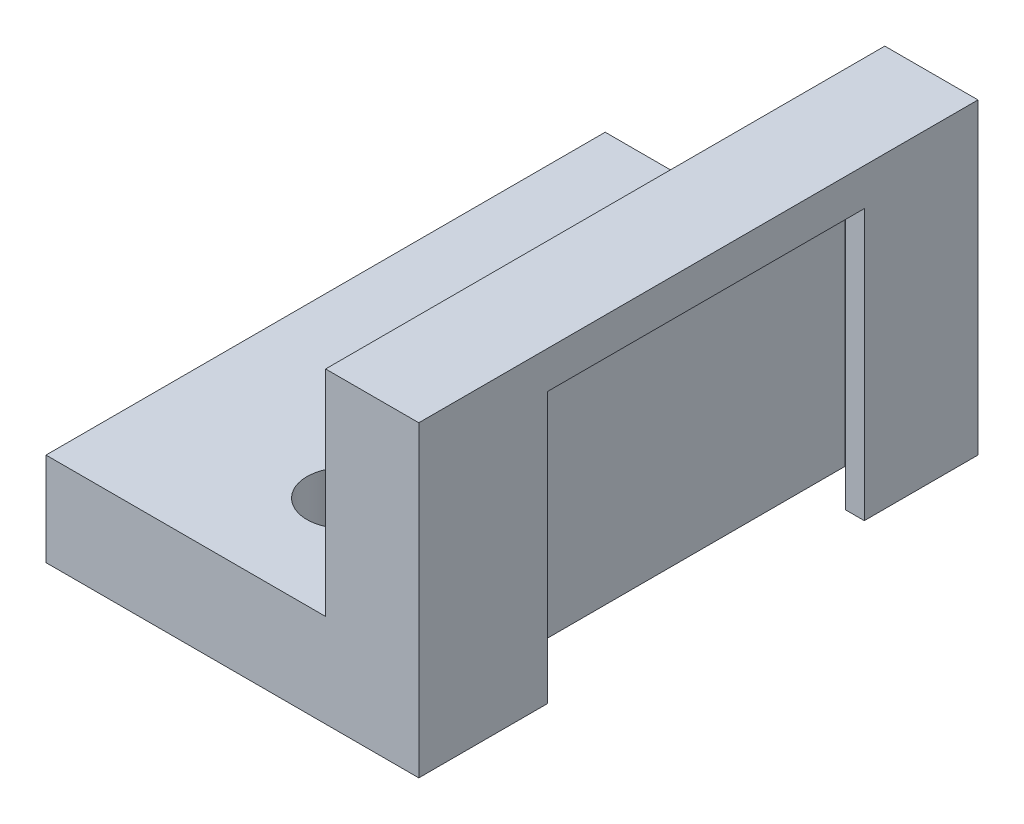
ISO-10303-21;
HEADER;
FILE_DESCRIPTION(('STEP AP214'),'2;1');
FILE_NAME('part.step','',(''),(''),'','','');
FILE_SCHEMA(('AUTOMOTIVE_DESIGN { 1 0 10303 214 1 1 1 1 }'));
ENDSEC;
DATA;
#1=APPLICATION_CONTEXT('core data for automotive mechanical design processes');
#2=APPLICATION_PROTOCOL_DEFINITION('international standard','automotive_design',2000,#1);
#3=PRODUCT_CONTEXT('',#1,'mechanical');
#4=PRODUCT('Part','Part','',(#3));
#5=PRODUCT_RELATED_PRODUCT_CATEGORY('part','',(#4));
#6=PRODUCT_DEFINITION_FORMATION('','',#4);
#7=PRODUCT_DEFINITION_CONTEXT('part definition',#1,'design');
#8=PRODUCT_DEFINITION('design','',#6,#7);
#9=PRODUCT_DEFINITION_SHAPE('','',#8);
#10=(LENGTH_UNIT() NAMED_UNIT(*) SI_UNIT(.MILLI.,.METRE.));
#11=(NAMED_UNIT(*) PLANE_ANGLE_UNIT() SI_UNIT($,.RADIAN.));
#12=(NAMED_UNIT(*) SI_UNIT($,.STERADIAN.) SOLID_ANGLE_UNIT());
#13=UNCERTAINTY_MEASURE_WITH_UNIT(LENGTH_MEASURE(1.E-05),#10,'distance_accuracy_value','');
#14=(GEOMETRIC_REPRESENTATION_CONTEXT(3) GLOBAL_UNCERTAINTY_ASSIGNED_CONTEXT((#13)) GLOBAL_UNIT_ASSIGNED_CONTEXT((#10,
#11,#12)) REPRESENTATION_CONTEXT('',''));
#15=CARTESIAN_POINT('',(0.,0.,0.));
#16=DIRECTION('',(0.,0.,1.));
#17=DIRECTION('',(1.,0.,0.));
#18=AXIS2_PLACEMENT_3D('',#15,#16,#17);
#19=CARTESIAN_POINT('',(10.,-0.00100000000000013,24.));
#20=DIRECTION('',(0.,1.,0.));
#21=DIRECTION('',(0.,0.,1.));
#22=AXIS2_PLACEMENT_3D('',#19,#20,#21);
#23=CYLINDRICAL_SURFACE('',#22,2.);
#24=CARTESIAN_POINT('',(10.,5.,24.));
#25=DIRECTION('',(0.,1.,0.));
#26=DIRECTION('',(0.,0.,-1.));
#27=AXIS2_PLACEMENT_3D('',#24,#25,#26);
#28=CIRCLE('',#27,2.);
#29=CARTESIAN_POINT('',(10.,5.,22.));
#30=VERTEX_POINT('',#29);
#31=EDGE_CURVE('E203',#30,#30,#28,.T.);
#32=ORIENTED_EDGE('',*,*,#31,.T.);
#33=EDGE_LOOP('',(#32));
#34=FACE_BOUND('',#33,.T.);
#35=CARTESIAN_POINT('',(10.,2.,24.));
#36=DIRECTION('',(0.,-1.,0.));
#37=DIRECTION('',(0.,0.,-1.));
#38=AXIS2_PLACEMENT_3D('',#35,#36,#37);
#39=CIRCLE('',#38,2.);
#40=CARTESIAN_POINT('',(10.,2.,22.));
#41=VERTEX_POINT('',#40);
#42=EDGE_CURVE('E191',#41,#41,#39,.F.);
#43=ORIENTED_EDGE('',*,*,#42,.F.);
#44=EDGE_LOOP('',(#43));
#45=FACE_BOUND('',#44,.T.);
#46=ADVANCED_FACE('F39',(#34,#45),#23,.F.);
#47=CARTESIAN_POINT('',(0.,0.,30.));
#48=DIRECTION('',(0.,1.,0.));
#49=DIRECTION('',(0.,0.,1.));
#50=AXIS2_PLACEMENT_3D('',#47,#48,#49);
#51=PLANE('',#50);
#52=CARTESIAN_POINT('',(10.,0.,24.));
#53=DIRECTION('',(0.,-1.,0.));
#54=DIRECTION('',(0.,0.,-1.));
#55=AXIS2_PLACEMENT_3D('',#52,#53,#54);
#56=CIRCLE('',#55,3.25);
#57=CARTESIAN_POINT('',(10.,0.,20.75));
#58=VERTEX_POINT('',#57);
#59=EDGE_CURVE('E192',#58,#58,#56,.T.);
#60=ORIENTED_EDGE('',*,*,#59,.F.);
#61=EDGE_LOOP('',(#60));
#62=FACE_BOUND('',#61,.T.);
#63=CARTESIAN_POINT('',(10.,0.,6.));
#64=DIRECTION('',(0.,-1.,0.));
#65=DIRECTION('',(0.,0.,1.));
#66=AXIS2_PLACEMENT_3D('',#63,#64,#65);
#67=CIRCLE('',#66,3.25);
#68=CARTESIAN_POINT('',(10.,0.,9.25));
#69=VERTEX_POINT('',#68);
#70=EDGE_CURVE('E185',#69,#69,#67,.T.);
#71=ORIENTED_EDGE('',*,*,#70,.F.);
#72=EDGE_LOOP('',(#71));
#73=FACE_BOUND('',#72,.T.);
#74=DIRECTION('',(0.,0.,-1.));
#75=VECTOR('',#74,1.);
#76=CARTESIAN_POINT('',(20.,0.,30.));
#77=LINE('',#76,#75);
#78=CARTESIAN_POINT('',(20.,0.,6.1));
#79=VERTEX_POINT('',#78);
#80=CARTESIAN_POINT('',(20.,0.,0.));
#81=VERTEX_POINT('',#80);
#82=EDGE_CURVE('E50',#79,#81,#77,.T.);
#83=ORIENTED_EDGE('',*,*,#82,.F.);
#84=DIRECTION('',(1.,0.,0.));
#85=VECTOR('',#84,1.);
#86=CARTESIAN_POINT('',(0.,0.,6.1));
#87=LINE('',#86,#85);
#88=CARTESIAN_POINT('',(19.,0.,6.1));
#89=VERTEX_POINT('',#88);
#90=EDGE_CURVE('E231',#89,#79,#87,.T.);
#91=ORIENTED_EDGE('',*,*,#90,.F.);
#92=DIRECTION('',(0.,0.,1.));
#93=VECTOR('',#92,1.);
#94=CARTESIAN_POINT('',(19.,0.,0.));
#95=LINE('',#94,#93);
#96=CARTESIAN_POINT('',(19.,0.,4.1));
#97=VERTEX_POINT('',#96);
#98=EDGE_CURVE('E263',#97,#89,#95,.T.);
#99=ORIENTED_EDGE('',*,*,#98,.F.);
#100=DIRECTION('',(1.,0.,0.));
#101=VECTOR('',#100,1.);
#102=CARTESIAN_POINT('',(0.,0.,4.1));
#103=LINE('',#102,#101);
#104=CARTESIAN_POINT('',(16.96,0.,4.1));
#105=VERTEX_POINT('',#104);
#106=EDGE_CURVE('E207',#105,#97,#103,.T.);
#107=ORIENTED_EDGE('',*,*,#106,.F.);
#108=DIRECTION('',(0.,0.,1.));
#109=VECTOR('',#108,1.);
#110=CARTESIAN_POINT('',(16.96,0.,0.));
#111=LINE('',#110,#109);
#112=CARTESIAN_POINT('',(16.96,0.,25.1));
#113=VERTEX_POINT('',#112);
#114=EDGE_CURVE('E215',#105,#113,#111,.T.);
#115=ORIENTED_EDGE('',*,*,#114,.T.);
#116=DIRECTION('',(1.,0.,0.));
#117=VECTOR('',#116,1.);
#118=CARTESIAN_POINT('',(0.,0.,25.1));
#119=LINE('',#118,#117);
#120=CARTESIAN_POINT('',(19.,0.,25.1));
#121=VERTEX_POINT('',#120);
#122=EDGE_CURVE('E219',#113,#121,#119,.T.);
#123=ORIENTED_EDGE('',*,*,#122,.T.);
#124=DIRECTION('',(0.,0.,-1.));
#125=VECTOR('',#124,1.);
#126=CARTESIAN_POINT('',(19.,0.,0.));
#127=LINE('',#126,#125);
#128=CARTESIAN_POINT('',(19.,0.,23.1));
#129=VERTEX_POINT('',#128);
#130=EDGE_CURVE('E223',#121,#129,#127,.T.);
#131=ORIENTED_EDGE('',*,*,#130,.T.);
#132=DIRECTION('',(1.,0.,0.));
#133=VECTOR('',#132,1.);
#134=CARTESIAN_POINT('',(0.,0.,23.1000000000001));
#135=LINE('',#134,#133);
#136=CARTESIAN_POINT('',(20.,0.,23.1));
#137=VERTEX_POINT('',#136);
#138=EDGE_CURVE('E227',#129,#137,#135,.T.);
#139=ORIENTED_EDGE('',*,*,#138,.T.);
#140=CARTESIAN_POINT('',(20.,0.,30.));
#141=VERTEX_POINT('',#140);
#142=EDGE_CURVE('E11',#141,#137,#77,.T.);
#143=ORIENTED_EDGE('',*,*,#142,.F.);
#144=DIRECTION('',(1.,0.,0.));
#145=VECTOR('',#144,1.);
#146=CARTESIAN_POINT('',(0.,0.,30.));
#147=LINE('',#146,#145);
#148=CARTESIAN_POINT('',(0.,0.,30.));
#149=VERTEX_POINT('',#148);
#150=EDGE_CURVE('E295',#149,#141,#147,.T.);
#151=ORIENTED_EDGE('',*,*,#150,.F.);
#152=DIRECTION('',(0.,0.,-1.));
#153=VECTOR('',#152,1.);
#154=CARTESIAN_POINT('',(0.,0.,30.));
#155=LINE('',#154,#153);
#156=CARTESIAN_POINT('',(0.,0.,0.));
#157=VERTEX_POINT('',#156);
#158=EDGE_CURVE('E304',#149,#157,#155,.T.);
#159=ORIENTED_EDGE('',*,*,#158,.T.);
#160=DIRECTION('',(1.,0.,0.));
#161=VECTOR('',#160,1.);
#162=CARTESIAN_POINT('',(0.,0.,0.));
#163=LINE('',#162,#161);
#164=EDGE_CURVE('E294',#157,#81,#163,.T.);
#165=ORIENTED_EDGE('',*,*,#164,.T.);
#166=EDGE_LOOP('',(#83,#91,#99,#107,#115,#123,#131,#139,#143,#151,#159,#165));
#167=FACE_BOUND('',#166,.T.);
#168=ADVANCED_FACE('F41',(#62,#73,#167),#51,.F.);
#169=CARTESIAN_POINT('',(20.,0.,30.));
#170=DIRECTION('',(-1.,0.,0.));
#171=DIRECTION('',(0.,-1.,0.));
#172=AXIS2_PLACEMENT_3D('',#169,#170,#171);
#173=PLANE('',#172);
#174=DIRECTION('',(0.,1.,0.));
#175=VECTOR('',#174,1.);
#176=CARTESIAN_POINT('',(20.,0.,0.));
#177=LINE('',#176,#175);
#178=CARTESIAN_POINT('',(20.,16.5,0.));
#179=VERTEX_POINT('',#178);
#180=EDGE_CURVE('E308',#81,#179,#177,.T.);
#181=ORIENTED_EDGE('',*,*,#180,.T.);
#182=DIRECTION('',(0.,0.,-1.));
#183=VECTOR('',#182,1.);
#184=CARTESIAN_POINT('',(20.,16.5,0.));
#185=LINE('',#184,#183);
#186=CARTESIAN_POINT('',(20.,16.5,30.));
#187=VERTEX_POINT('',#186);
#188=EDGE_CURVE('E169',#187,#179,#185,.T.);
#189=ORIENTED_EDGE('',*,*,#188,.F.);
#190=DIRECTION('',(0.,1.,0.));
#191=VECTOR('',#190,1.);
#192=CARTESIAN_POINT('',(20.,0.,30.));
#193=LINE('',#192,#191);
#194=EDGE_CURVE('E90',#141,#187,#193,.T.);
#195=ORIENTED_EDGE('',*,*,#194,.F.);
#196=ORIENTED_EDGE('',*,*,#142,.T.);
#197=DIRECTION('',(0.,1.,0.));
#198=VECTOR('',#197,1.);
#199=CARTESIAN_POINT('',(20.,-0.000999999999999265,23.1));
#200=LINE('',#199,#198);
#201=CARTESIAN_POINT('',(20.,14.5,23.1));
#202=VERTEX_POINT('',#201);
#203=EDGE_CURVE('E264',#137,#202,#200,.T.);
#204=ORIENTED_EDGE('',*,*,#203,.T.);
#205=DIRECTION('',(0.,0.,-1.));
#206=VECTOR('',#205,1.);
#207=CARTESIAN_POINT('',(20.,14.5,0.));
#208=LINE('',#207,#206);
#209=CARTESIAN_POINT('',(20.,14.5,6.09999999999999));
#210=VERTEX_POINT('',#209);
#211=EDGE_CURVE('E176',#202,#210,#208,.T.);
#212=ORIENTED_EDGE('',*,*,#211,.T.);
#213=DIRECTION('',(0.,1.,0.));
#214=VECTOR('',#213,1.);
#215=CARTESIAN_POINT('',(20.,-0.000999999999999265,6.1));
#216=LINE('',#215,#214);
#217=EDGE_CURVE('E259',#79,#210,#216,.T.);
#218=ORIENTED_EDGE('',*,*,#217,.F.);
#219=ORIENTED_EDGE('',*,*,#82,.T.);
#220=EDGE_LOOP('',(#181,#189,#195,#196,#204,#212,#218,#219));
#221=FACE_BOUND('',#220,.T.);
#222=ADVANCED_FACE('F356',(#221),#173,.F.);
#223=CARTESIAN_POINT('',(15.,14.5,30.));
#224=DIRECTION('',(1.,0.,0.));
#225=DIRECTION('',(0.,1.,0.));
#226=AXIS2_PLACEMENT_3D('',#223,#224,#225);
#227=PLANE('',#226);
#228=DIRECTION('',(0.,-1.,0.));
#229=VECTOR('',#228,1.);
#230=CARTESIAN_POINT('',(15.,14.5,0.));
#231=LINE('',#230,#229);
#232=CARTESIAN_POINT('',(15.,16.5,0.));
#233=VERTEX_POINT('',#232);
#234=CARTESIAN_POINT('',(15.,5.,0.));
#235=VERTEX_POINT('',#234);
#236=EDGE_CURVE('E311',#233,#235,#231,.T.);
#237=ORIENTED_EDGE('',*,*,#236,.T.);
#238=DIRECTION('',(0.,0.,-1.));
#239=VECTOR('',#238,1.);
#240=CARTESIAN_POINT('',(15.,5.,30.));
#241=LINE('',#240,#239);
#242=CARTESIAN_POINT('',(15.,5.,30.));
#243=VERTEX_POINT('',#242);
#244=EDGE_CURVE('E158',#243,#235,#241,.T.);
#245=ORIENTED_EDGE('',*,*,#244,.F.);
#246=DIRECTION('',(0.,-1.,0.));
#247=VECTOR('',#246,1.);
#248=CARTESIAN_POINT('',(15.,14.5,30.));
#249=LINE('',#248,#247);
#250=CARTESIAN_POINT('',(15.,16.5,30.));
#251=VERTEX_POINT('',#250);
#252=EDGE_CURVE('E153',#251,#243,#249,.T.);
#253=ORIENTED_EDGE('',*,*,#252,.F.);
#254=DIRECTION('',(0.,0.,1.));
#255=VECTOR('',#254,1.);
#256=CARTESIAN_POINT('',(15.,16.5,0.));
#257=LINE('',#256,#255);
#258=EDGE_CURVE('E157',#233,#251,#257,.T.);
#259=ORIENTED_EDGE('',*,*,#258,.F.);
#260=EDGE_LOOP('',(#237,#245,#253,#259));
#261=FACE_BOUND('',#260,.T.);
#262=ADVANCED_FACE('F155',(#261),#227,.F.);
#263=CARTESIAN_POINT('',(15.,5.,30.));
#264=DIRECTION('',(0.,-1.,0.));
#265=DIRECTION('',(0.,0.,-1.));
#266=AXIS2_PLACEMENT_3D('',#263,#264,#265);
#267=PLANE('',#266);
#268=ORIENTED_EDGE('',*,*,#31,.F.);
#269=EDGE_LOOP('',(#268));
#270=FACE_BOUND('',#269,.T.);
#271=CARTESIAN_POINT('',(10.,5.,6.));
#272=DIRECTION('',(0.,1.,0.));
#273=DIRECTION('',(0.,0.,1.));
#274=AXIS2_PLACEMENT_3D('',#271,#272,#273);
#275=CIRCLE('',#274,2.);
#276=CARTESIAN_POINT('',(10.,5.,8.));
#277=VERTEX_POINT('',#276);
#278=EDGE_CURVE('E208',#277,#277,#275,.T.);
#279=ORIENTED_EDGE('',*,*,#278,.F.);
#280=EDGE_LOOP('',(#279));
#281=FACE_BOUND('',#280,.T.);
#282=DIRECTION('',(-1.,0.,0.));
#283=VECTOR('',#282,1.);
#284=CARTESIAN_POINT('',(15.,5.,0.));
#285=LINE('',#284,#283);
#286=CARTESIAN_POINT('',(0.,5.,0.));
#287=VERTEX_POINT('',#286);
#288=EDGE_CURVE('E77',#235,#287,#285,.T.);
#289=ORIENTED_EDGE('',*,*,#288,.T.);
#290=DIRECTION('',(0.,0.,-1.));
#291=VECTOR('',#290,1.);
#292=CARTESIAN_POINT('',(0.,5.,30.));
#293=LINE('',#292,#291);
#294=CARTESIAN_POINT('',(0.,5.,30.));
#295=VERTEX_POINT('',#294);
#296=EDGE_CURVE('E320',#295,#287,#293,.T.);
#297=ORIENTED_EDGE('',*,*,#296,.F.);
#298=DIRECTION('',(-1.,0.,0.));
#299=VECTOR('',#298,1.);
#300=CARTESIAN_POINT('',(15.,5.,30.));
#301=LINE('',#300,#299);
#302=EDGE_CURVE('E161',#243,#295,#301,.T.);
#303=ORIENTED_EDGE('',*,*,#302,.F.);
#304=ORIENTED_EDGE('',*,*,#244,.T.);
#305=EDGE_LOOP('',(#289,#297,#303,#304));
#306=FACE_BOUND('',#305,.T.);
#307=ADVANCED_FACE('F399',(#270,#281,#306),#267,.F.);
#308=CARTESIAN_POINT('',(0.,5.,30.));
#309=DIRECTION('',(1.,0.,0.));
#310=DIRECTION('',(0.,1.,0.));
#311=AXIS2_PLACEMENT_3D('',#308,#309,#310);
#312=PLANE('',#311);
#313=DIRECTION('',(0.,-1.,0.));
#314=VECTOR('',#313,1.);
#315=CARTESIAN_POINT('',(0.,5.,0.));
#316=LINE('',#315,#314);
#317=EDGE_CURVE('E83',#287,#157,#316,.T.);
#318=ORIENTED_EDGE('',*,*,#317,.T.);
#319=ORIENTED_EDGE('',*,*,#158,.F.);
#320=DIRECTION('',(0.,-1.,0.));
#321=VECTOR('',#320,1.);
#322=CARTESIAN_POINT('',(0.,5.,30.));
#323=LINE('',#322,#321);
#324=EDGE_CURVE('E59',#295,#149,#323,.T.);
#325=ORIENTED_EDGE('',*,*,#324,.F.);
#326=ORIENTED_EDGE('',*,*,#296,.T.);
#327=EDGE_LOOP('',(#318,#319,#325,#326));
#328=FACE_BOUND('',#327,.T.);
#329=ADVANCED_FACE('F393',(#328),#312,.F.);
#330=CARTESIAN_POINT('',(0.,0.,30.));
#331=DIRECTION('',(0.,0.,1.));
#332=DIRECTION('',(1.,0.,0.));
#333=AXIS2_PLACEMENT_3D('',#330,#331,#332);
#334=PLANE('',#333);
#335=ORIENTED_EDGE('',*,*,#150,.T.);
#336=ORIENTED_EDGE('',*,*,#194,.T.);
#337=DIRECTION('',(1.,0.,0.));
#338=VECTOR('',#337,1.);
#339=CARTESIAN_POINT('',(15.,16.5,30.));
#340=LINE('',#339,#338);
#341=EDGE_CURVE('E164',#251,#187,#340,.T.);
#342=ORIENTED_EDGE('',*,*,#341,.F.);
#343=ORIENTED_EDGE('',*,*,#252,.T.);
#344=ORIENTED_EDGE('',*,*,#302,.T.);
#345=ORIENTED_EDGE('',*,*,#324,.T.);
#346=EDGE_LOOP('',(#335,#336,#342,#343,#344,#345));
#347=FACE_BOUND('',#346,.T.);
#348=ADVANCED_FACE('F165',(#347),#334,.T.);
#349=CARTESIAN_POINT('',(0.,0.,0.));
#350=DIRECTION('',(0.,0.,1.));
#351=DIRECTION('',(1.,0.,0.));
#352=AXIS2_PLACEMENT_3D('',#349,#350,#351);
#353=PLANE('',#352);
#354=ORIENTED_EDGE('',*,*,#164,.F.);
#355=ORIENTED_EDGE('',*,*,#317,.F.);
#356=ORIENTED_EDGE('',*,*,#288,.F.);
#357=ORIENTED_EDGE('',*,*,#236,.F.);
#358=DIRECTION('',(-1.,0.,0.));
#359=VECTOR('',#358,1.);
#360=CARTESIAN_POINT('',(15.,16.5,0.));
#361=LINE('',#360,#359);
#362=EDGE_CURVE('E174',#179,#233,#361,.T.);
#363=ORIENTED_EDGE('',*,*,#362,.F.);
#364=ORIENTED_EDGE('',*,*,#180,.F.);
#365=EDGE_LOOP('',(#354,#355,#356,#357,#363,#364));
#366=FACE_BOUND('',#365,.T.);
#367=ADVANCED_FACE('F389',(#366),#353,.F.);
#368=CARTESIAN_POINT('',(0.,-0.000999999999999265,6.1));
#369=DIRECTION('',(0.,0.,-1.));
#370=DIRECTION('',(-1.,0.,0.));
#371=AXIS2_PLACEMENT_3D('',#368,#369,#370);
#372=PLANE('',#371);
#373=ORIENTED_EDGE('',*,*,#90,.T.);
#374=ORIENTED_EDGE('',*,*,#217,.T.);
#375=DIRECTION('',(-1.,0.,0.));
#376=VECTOR('',#375,1.);
#377=CARTESIAN_POINT('',(0.,14.5,6.1));
#378=LINE('',#377,#376);
#379=CARTESIAN_POINT('',(19.,14.5,6.09999999999999));
#380=VERTEX_POINT('',#379);
#381=EDGE_CURVE('E234',#210,#380,#378,.T.);
#382=ORIENTED_EDGE('',*,*,#381,.T.);
#383=DIRECTION('',(0.,1.,0.));
#384=VECTOR('',#383,1.);
#385=CARTESIAN_POINT('',(19.,-0.000999999999999265,6.1));
#386=LINE('',#385,#384);
#387=EDGE_CURVE('E258',#89,#380,#386,.T.);
#388=ORIENTED_EDGE('',*,*,#387,.F.);
#389=EDGE_LOOP('',(#373,#374,#382,#388));
#390=FACE_BOUND('',#389,.T.);
#391=ADVANCED_FACE('F367',(#390),#372,.F.);
#392=CARTESIAN_POINT('',(0.,-0.000999999999999265,23.1000000000001));
#393=DIRECTION('',(0.,0.,-1.));
#394=DIRECTION('',(-1.,0.,0.));
#395=AXIS2_PLACEMENT_3D('',#392,#393,#394);
#396=PLANE('',#395);
#397=DIRECTION('',(0.,1.,0.));
#398=VECTOR('',#397,1.);
#399=CARTESIAN_POINT('',(19.,-0.000999999999999265,23.1));
#400=LINE('',#399,#398);
#401=CARTESIAN_POINT('',(19.,14.5,23.1));
#402=VERTEX_POINT('',#401);
#403=EDGE_CURVE('E268',#129,#402,#400,.T.);
#404=ORIENTED_EDGE('',*,*,#403,.T.);
#405=DIRECTION('',(-1.,0.,0.));
#406=VECTOR('',#405,1.);
#407=CARTESIAN_POINT('',(0.,14.5,23.1000000000001));
#408=LINE('',#407,#406);
#409=EDGE_CURVE('E255',#202,#402,#408,.T.);
#410=ORIENTED_EDGE('',*,*,#409,.F.);
#411=ORIENTED_EDGE('',*,*,#203,.F.);
#412=ORIENTED_EDGE('',*,*,#138,.F.);
#413=EDGE_LOOP('',(#404,#410,#411,#412));
#414=FACE_BOUND('',#413,.T.);
#415=ADVANCED_FACE('F363',(#414),#396,.T.);
#416=CARTESIAN_POINT('',(19.,-0.000999999999999265,0.));
#417=DIRECTION('',(-1.,0.,0.));
#418=DIRECTION('',(0.,0.,1.));
#419=AXIS2_PLACEMENT_3D('',#416,#417,#418);
#420=PLANE('',#419);
#421=DIRECTION('',(0.,1.,0.));
#422=VECTOR('',#421,1.);
#423=CARTESIAN_POINT('',(19.,-0.000999999999999265,25.1));
#424=LINE('',#423,#422);
#425=CARTESIAN_POINT('',(19.,14.5,25.1));
#426=VERTEX_POINT('',#425);
#427=EDGE_CURVE('E272',#121,#426,#424,.T.);
#428=ORIENTED_EDGE('',*,*,#427,.T.);
#429=DIRECTION('',(0.,0.,1.));
#430=VECTOR('',#429,1.);
#431=CARTESIAN_POINT('',(19.,14.5,0.));
#432=LINE('',#431,#430);
#433=EDGE_CURVE('E252',#402,#426,#432,.T.);
#434=ORIENTED_EDGE('',*,*,#433,.F.);
#435=ORIENTED_EDGE('',*,*,#403,.F.);
#436=ORIENTED_EDGE('',*,*,#130,.F.);
#437=EDGE_LOOP('',(#428,#434,#435,#436));
#438=FACE_BOUND('',#437,.T.);
#439=ADVANCED_FACE('F366',(#438),#420,.T.);
#440=CARTESIAN_POINT('',(0.,-0.000999999999999265,25.1));
#441=DIRECTION('',(0.,0.,-1.));
#442=DIRECTION('',(-1.,0.,0.));
#443=AXIS2_PLACEMENT_3D('',#440,#441,#442);
#444=PLANE('',#443);
#445=DIRECTION('',(0.,1.,0.));
#446=VECTOR('',#445,1.);
#447=CARTESIAN_POINT('',(16.96,-0.000999999999999265,25.1));
#448=LINE('',#447,#446);
#449=CARTESIAN_POINT('',(16.96,14.5,25.1));
#450=VERTEX_POINT('',#449);
#451=EDGE_CURVE('E276',#113,#450,#448,.T.);
#452=ORIENTED_EDGE('',*,*,#451,.T.);
#453=DIRECTION('',(-1.,0.,0.));
#454=VECTOR('',#453,1.);
#455=CARTESIAN_POINT('',(0.,14.5,25.1));
#456=LINE('',#455,#454);
#457=EDGE_CURVE('E249',#426,#450,#456,.T.);
#458=ORIENTED_EDGE('',*,*,#457,.F.);
#459=ORIENTED_EDGE('',*,*,#427,.F.);
#460=ORIENTED_EDGE('',*,*,#122,.F.);
#461=EDGE_LOOP('',(#452,#458,#459,#460));
#462=FACE_BOUND('',#461,.T.);
#463=ADVANCED_FACE('F371',(#462),#444,.T.);
#464=CARTESIAN_POINT('',(16.96,-0.000999999999999265,0.));
#465=DIRECTION('',(1.,0.,0.));
#466=DIRECTION('',(0.,0.,-1.));
#467=AXIS2_PLACEMENT_3D('',#464,#465,#466);
#468=PLANE('',#467);
#469=DIRECTION('',(0.,1.,0.));
#470=VECTOR('',#469,1.);
#471=CARTESIAN_POINT('',(16.96,-0.000999999999999265,4.1));
#472=LINE('',#471,#470);
#473=CARTESIAN_POINT('',(16.96,14.5,4.1));
#474=VERTEX_POINT('',#473);
#475=EDGE_CURVE('E280',#105,#474,#472,.T.);
#476=ORIENTED_EDGE('',*,*,#475,.T.);
#477=DIRECTION('',(0.,0.,-1.));
#478=VECTOR('',#477,1.);
#479=CARTESIAN_POINT('',(16.96,14.5,0.));
#480=LINE('',#479,#478);
#481=EDGE_CURVE('E246',#450,#474,#480,.T.);
#482=ORIENTED_EDGE('',*,*,#481,.F.);
#483=ORIENTED_EDGE('',*,*,#451,.F.);
#484=ORIENTED_EDGE('',*,*,#114,.F.);
#485=EDGE_LOOP('',(#476,#482,#483,#484));
#486=FACE_BOUND('',#485,.T.);
#487=ADVANCED_FACE('F375',(#486),#468,.T.);
#488=CARTESIAN_POINT('',(0.,-0.000999999999999265,4.1));
#489=DIRECTION('',(0.,0.,-1.));
#490=DIRECTION('',(-1.,0.,0.));
#491=AXIS2_PLACEMENT_3D('',#488,#489,#490);
#492=PLANE('',#491);
#493=ORIENTED_EDGE('',*,*,#106,.T.);
#494=DIRECTION('',(0.,1.,0.));
#495=VECTOR('',#494,1.);
#496=CARTESIAN_POINT('',(19.,-0.000999999999999265,4.1));
#497=LINE('',#496,#495);
#498=CARTESIAN_POINT('',(19.,14.5,4.1));
#499=VERTEX_POINT('',#498);
#500=EDGE_CURVE('E284',#97,#499,#497,.T.);
#501=ORIENTED_EDGE('',*,*,#500,.T.);
#502=DIRECTION('',(-1.,0.,0.));
#503=VECTOR('',#502,1.);
#504=CARTESIAN_POINT('',(0.,14.5,4.1));
#505=LINE('',#504,#503);
#506=EDGE_CURVE('E242',#499,#474,#505,.T.);
#507=ORIENTED_EDGE('',*,*,#506,.T.);
#508=ORIENTED_EDGE('',*,*,#475,.F.);
#509=EDGE_LOOP('',(#493,#501,#507,#508));
#510=FACE_BOUND('',#509,.T.);
#511=ADVANCED_FACE('F379',(#510),#492,.F.);
#512=CARTESIAN_POINT('',(19.,-0.000999999999999265,0.));
#513=DIRECTION('',(1.,0.,0.));
#514=DIRECTION('',(0.,0.,-1.));
#515=AXIS2_PLACEMENT_3D('',#512,#513,#514);
#516=PLANE('',#515);
#517=ORIENTED_EDGE('',*,*,#98,.T.);
#518=ORIENTED_EDGE('',*,*,#387,.T.);
#519=DIRECTION('',(0.,0.,-1.));
#520=VECTOR('',#519,1.);
#521=CARTESIAN_POINT('',(19.,14.5,0.));
#522=LINE('',#521,#520);
#523=EDGE_CURVE('E238',#380,#499,#522,.T.);
#524=ORIENTED_EDGE('',*,*,#523,.T.);
#525=ORIENTED_EDGE('',*,*,#500,.F.);
#526=EDGE_LOOP('',(#517,#518,#524,#525));
#527=FACE_BOUND('',#526,.T.);
#528=ADVANCED_FACE('F362',(#527),#516,.F.);
#529=CARTESIAN_POINT('',(10.,-0.00100000000000013,6.));
#530=DIRECTION('',(0.,1.,0.));
#531=DIRECTION('',(0.,0.,1.));
#532=AXIS2_PLACEMENT_3D('',#529,#530,#531);
#533=CYLINDRICAL_SURFACE('',#532,2.);
#534=CARTESIAN_POINT('',(10.,2.,6.));
#535=DIRECTION('',(0.,1.,0.));
#536=DIRECTION('',(0.,0.,1.));
#537=AXIS2_PLACEMENT_3D('',#534,#535,#536);
#538=CIRCLE('',#537,2.);
#539=CARTESIAN_POINT('',(10.,2.,8.));
#540=VERTEX_POINT('',#539);
#541=EDGE_CURVE('E43',#540,#540,#538,.F.);
#542=ORIENTED_EDGE('',*,*,#541,.T.);
#543=EDGE_LOOP('',(#542));
#544=FACE_BOUND('',#543,.T.);
#545=ORIENTED_EDGE('',*,*,#278,.T.);
#546=EDGE_LOOP('',(#545));
#547=FACE_BOUND('',#546,.T.);
#548=ADVANCED_FACE('F332',(#544,#547),#533,.F.);
#549=CARTESIAN_POINT('',(10.,2.,24.));
#550=DIRECTION('',(0.,-1.,0.));
#551=DIRECTION('',(0.,0.,-1.));
#552=AXIS2_PLACEMENT_3D('',#549,#550,#551);
#553=PLANE('',#552);
#554=CARTESIAN_POINT('',(10.,2.,24.));
#555=DIRECTION('',(0.,-1.,0.));
#556=DIRECTION('',(0.,0.,-1.));
#557=AXIS2_PLACEMENT_3D('',#554,#555,#556);
#558=CIRCLE('',#557,3.25);
#559=CARTESIAN_POINT('',(10.,2.,20.75));
#560=VERTEX_POINT('',#559);
#561=EDGE_CURVE('E187',#560,#560,#558,.T.);
#562=ORIENTED_EDGE('',*,*,#561,.T.);
#563=EDGE_LOOP('',(#562));
#564=FACE_BOUND('',#563,.T.);
#565=ORIENTED_EDGE('',*,*,#42,.T.);
#566=EDGE_LOOP('',(#565));
#567=FACE_BOUND('',#566,.T.);
#568=ADVANCED_FACE('F347',(#564,#567),#553,.T.);
#569=CARTESIAN_POINT('',(10.,2.,24.));
#570=DIRECTION('',(0.,-1.,0.));
#571=DIRECTION('',(0.,0.,-1.));
#572=AXIS2_PLACEMENT_3D('',#569,#570,#571);
#573=CYLINDRICAL_SURFACE('',#572,3.25);
#574=ORIENTED_EDGE('',*,*,#561,.F.);
#575=EDGE_LOOP('',(#574));
#576=FACE_BOUND('',#575,.T.);
#577=ORIENTED_EDGE('',*,*,#59,.T.);
#578=EDGE_LOOP('',(#577));
#579=FACE_BOUND('',#578,.T.);
#580=ADVANCED_FACE('F338',(#576,#579),#573,.F.);
#581=CARTESIAN_POINT('',(10.,2.,6.));
#582=DIRECTION('',(0.,1.,0.));
#583=DIRECTION('',(0.,0.,1.));
#584=AXIS2_PLACEMENT_3D('',#581,#582,#583);
#585=PLANE('',#584);
#586=CARTESIAN_POINT('',(10.,2.,6.));
#587=DIRECTION('',(0.,-1.,0.));
#588=DIRECTION('',(0.,0.,1.));
#589=AXIS2_PLACEMENT_3D('',#586,#587,#588);
#590=CIRCLE('',#589,3.25);
#591=CARTESIAN_POINT('',(10.,2.,9.25));
#592=VERTEX_POINT('',#591);
#593=EDGE_CURVE('E196',#592,#592,#590,.T.);
#594=ORIENTED_EDGE('',*,*,#593,.T.);
#595=EDGE_LOOP('',(#594));
#596=FACE_BOUND('',#595,.T.);
#597=ORIENTED_EDGE('',*,*,#541,.F.);
#598=EDGE_LOOP('',(#597));
#599=FACE_BOUND('',#598,.T.);
#600=ADVANCED_FACE('F335',(#596,#599),#585,.F.);
#601=CARTESIAN_POINT('',(10.,2.,6.));
#602=DIRECTION('',(0.,-1.,0.));
#603=DIRECTION('',(0.,0.,-1.));
#604=AXIS2_PLACEMENT_3D('',#601,#602,#603);
#605=CYLINDRICAL_SURFACE('',#604,3.25);
#606=ORIENTED_EDGE('',*,*,#593,.F.);
#607=EDGE_LOOP('',(#606));
#608=FACE_BOUND('',#607,.T.);
#609=ORIENTED_EDGE('',*,*,#70,.T.);
#610=EDGE_LOOP('',(#609));
#611=FACE_BOUND('',#610,.T.);
#612=ADVANCED_FACE('F337',(#608,#611),#605,.F.);
#613=CARTESIAN_POINT('',(0.,16.5,0.));
#614=DIRECTION('',(0.,1.,0.));
#615=DIRECTION('',(0.,0.,1.));
#616=AXIS2_PLACEMENT_3D('',#613,#614,#615);
#617=PLANE('',#616);
#618=ORIENTED_EDGE('',*,*,#258,.T.);
#619=ORIENTED_EDGE('',*,*,#341,.T.);
#620=ORIENTED_EDGE('',*,*,#188,.T.);
#621=ORIENTED_EDGE('',*,*,#362,.T.);
#622=EDGE_LOOP('',(#618,#619,#620,#621));
#623=FACE_BOUND('',#622,.T.);
#624=ADVANCED_FACE('F172',(#623),#617,.T.);
#625=CARTESIAN_POINT('',(0.,14.5,0.));
#626=DIRECTION('',(0.,1.,0.));
#627=DIRECTION('',(0.,0.,1.));
#628=AXIS2_PLACEMENT_3D('',#625,#626,#627);
#629=PLANE('',#628);
#630=ORIENTED_EDGE('',*,*,#381,.F.);
#631=ORIENTED_EDGE('',*,*,#211,.F.);
#632=ORIENTED_EDGE('',*,*,#409,.T.);
#633=ORIENTED_EDGE('',*,*,#433,.T.);
#634=ORIENTED_EDGE('',*,*,#457,.T.);
#635=ORIENTED_EDGE('',*,*,#481,.T.);
#636=ORIENTED_EDGE('',*,*,#506,.F.);
#637=ORIENTED_EDGE('',*,*,#523,.F.);
#638=EDGE_LOOP('',(#630,#631,#632,#633,#634,#635,#636,#637));
#639=FACE_BOUND('',#638,.T.);
#640=ADVANCED_FACE('F418',(#639),#629,.F.);
#641=CLOSED_SHELL('',(#46,#168,#222,#262,#307,#329,#348,#367,#391,#415,#439,#463,#487,#511,#528,
#548,#568,#580,#600,#612,#624,#640));
#642=MANIFOLD_SOLID_BREP('B2',#641);
#643=ADVANCED_BREP_SHAPE_REPRESENTATION('',(#18,#642),#14);
#644=SHAPE_DEFINITION_REPRESENTATION(#9,#643);
ENDSEC;
END-ISO-10303-21;
